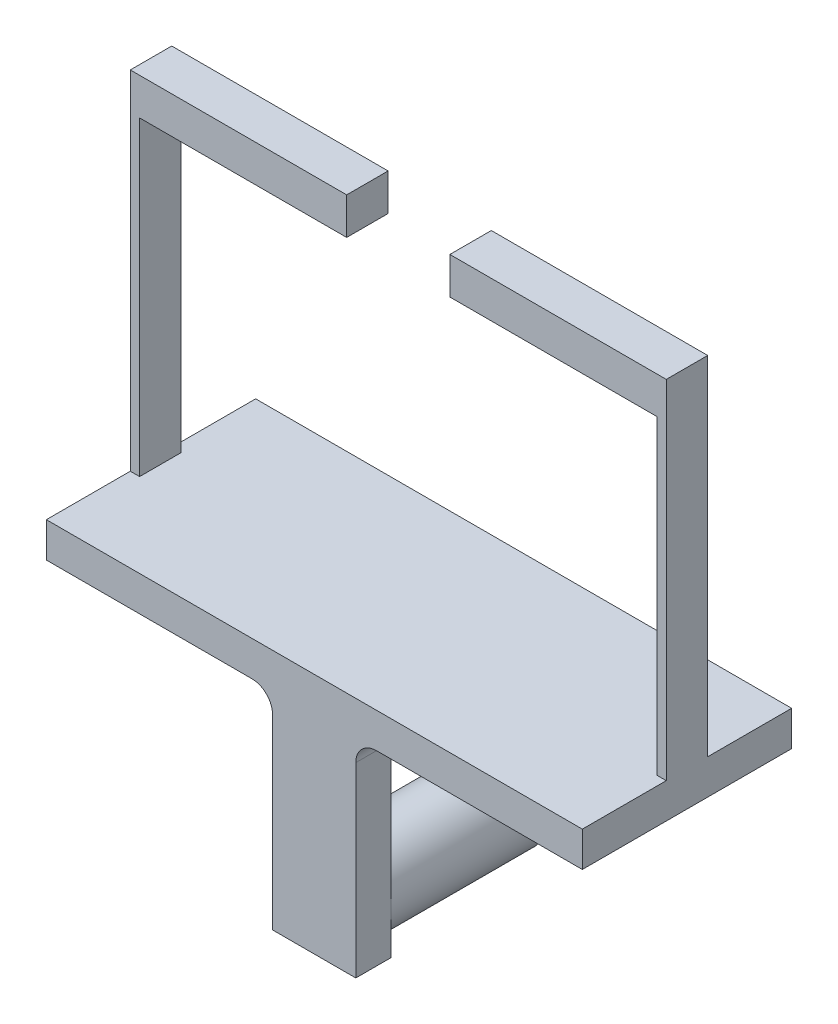
ISO-10303-21;
HEADER;
FILE_DESCRIPTION(('STEP AP214'),'2;1');
FILE_NAME('part.step','',(''),(''),'','','');
FILE_SCHEMA(('AUTOMOTIVE_DESIGN { 1 0 10303 214 1 1 1 1 }'));
ENDSEC;
DATA;
#1=APPLICATION_CONTEXT('core data for automotive mechanical design processes');
#2=APPLICATION_PROTOCOL_DEFINITION('international standard','automotive_design',2000,#1);
#3=PRODUCT_CONTEXT('',#1,'mechanical');
#4=PRODUCT('Part','Part','',(#3));
#5=PRODUCT_RELATED_PRODUCT_CATEGORY('part','',(#4));
#6=PRODUCT_DEFINITION_FORMATION('','',#4);
#7=PRODUCT_DEFINITION_CONTEXT('part definition',#1,'design');
#8=PRODUCT_DEFINITION('design','',#6,#7);
#9=PRODUCT_DEFINITION_SHAPE('','',#8);
#10=(LENGTH_UNIT() NAMED_UNIT(*) SI_UNIT(.MILLI.,.METRE.));
#11=(NAMED_UNIT(*) PLANE_ANGLE_UNIT() SI_UNIT($,.RADIAN.));
#12=(NAMED_UNIT(*) SI_UNIT($,.STERADIAN.) SOLID_ANGLE_UNIT());
#13=UNCERTAINTY_MEASURE_WITH_UNIT(LENGTH_MEASURE(1.E-05),#10,'distance_accuracy_value','');
#14=(GEOMETRIC_REPRESENTATION_CONTEXT(3) GLOBAL_UNCERTAINTY_ASSIGNED_CONTEXT((#13)) GLOBAL_UNIT_ASSIGNED_CONTEXT((#10,
#11,#12)) REPRESENTATION_CONTEXT('',''));
#15=CARTESIAN_POINT('',(0.,0.,0.));
#16=DIRECTION('',(0.,0.,1.));
#17=DIRECTION('',(1.,0.,0.));
#18=AXIS2_PLACEMENT_3D('',#15,#16,#17);
#19=CARTESIAN_POINT('',(0.,29.68752,0.));
#20=DIRECTION('',(0.,-1.,0.));
#21=DIRECTION('',(0.,0.,-1.));
#22=AXIS2_PLACEMENT_3D('',#19,#20,#21);
#23=PLANE('',#22);
#24=DIRECTION('',(1.,0.,0.));
#25=VECTOR('',#24,1.);
#26=CARTESIAN_POINT('',(-44.9980277605177,29.68752,-17.9190480402712));
#27=LINE('',#26,#25);
#28=CARTESIAN_POINT('',(-44.9980277605177,29.68752,-17.9190480402712));
#29=VERTEX_POINT('',#28);
#30=CARTESIAN_POINT('',(-43.8550277605177,29.68752,-17.9190480402712));
#31=VERTEX_POINT('',#30);
#32=EDGE_CURVE('E281',#29,#31,#27,.T.);
#33=ORIENTED_EDGE('',*,*,#32,.F.);
#34=DIRECTION('',(0.,0.,1.));
#35=VECTOR('',#34,1.);
#36=CARTESIAN_POINT('',(-44.9980277605177,29.68752,-7.63204804027117));
#37=LINE('',#36,#35);
#38=CARTESIAN_POINT('',(-44.9980277605177,29.68752,-7.63204804027117));
#39=VERTEX_POINT('',#38);
#40=EDGE_CURVE('E221',#29,#39,#37,.T.);
#41=ORIENTED_EDGE('',*,*,#40,.T.);
#42=DIRECTION('',(1.,0.,0.));
#43=VECTOR('',#42,1.);
#44=CARTESIAN_POINT('',(-44.9980277605177,29.68752,-7.63204804027117));
#45=LINE('',#44,#43);
#46=CARTESIAN_POINT('',(20.6965322394823,29.68752,-7.63204804027119));
#47=VERTEX_POINT('',#46);
#48=EDGE_CURVE('E326',#39,#47,#45,.T.);
#49=ORIENTED_EDGE('',*,*,#48,.T.);
#50=DIRECTION('',(0.,0.,-1.));
#51=VECTOR('',#50,1.);
#52=CARTESIAN_POINT('',(20.6965322394823,29.68752,-7.63204804027119));
#53=LINE('',#52,#51);
#54=CARTESIAN_POINT('',(20.6965322394823,29.68752,-17.9190480402712));
#55=VERTEX_POINT('',#54);
#56=EDGE_CURVE('E321',#47,#55,#53,.T.);
#57=ORIENTED_EDGE('',*,*,#56,.T.);
#58=DIRECTION('',(1.,0.,0.));
#59=VECTOR('',#58,1.);
#60=CARTESIAN_POINT('',(20.6965322394823,29.68752,-17.9190480402712));
#61=LINE('',#60,#59);
#62=CARTESIAN_POINT('',(19.5414560760783,29.68752,-17.9190480402712));
#63=VERTEX_POINT('',#62);
#64=EDGE_CURVE('E312',#63,#55,#61,.T.);
#65=ORIENTED_EDGE('',*,*,#64,.F.);
#66=DIRECTION('',(0.,0.,1.));
#67=VECTOR('',#66,1.);
#68=CARTESIAN_POINT('',(19.5414560760783,29.68752,-22.9990480402712));
#69=LINE('',#68,#67);
#70=CARTESIAN_POINT('',(19.5414560760783,29.68752,-22.9990480402712));
#71=VERTEX_POINT('',#70);
#72=EDGE_CURVE('E317',#71,#63,#69,.T.);
#73=ORIENTED_EDGE('',*,*,#72,.F.);
#74=DIRECTION('',(-1.,0.,0.));
#75=VECTOR('',#74,1.);
#76=CARTESIAN_POINT('',(20.6965322394823,29.68752,-22.9990480402712));
#77=LINE('',#76,#75);
#78=CARTESIAN_POINT('',(20.6965322394823,29.68752,-22.9990480402712));
#79=VERTEX_POINT('',#78);
#80=EDGE_CURVE('E288',#79,#71,#77,.T.);
#81=ORIENTED_EDGE('',*,*,#80,.F.);
#82=CARTESIAN_POINT('',(20.6965322394823,29.68752,-33.2860480402712));
#83=VERTEX_POINT('',#82);
#84=EDGE_CURVE('E327',#79,#83,#53,.T.);
#85=ORIENTED_EDGE('',*,*,#84,.T.);
#86=DIRECTION('',(-1.,0.,0.));
#87=VECTOR('',#86,1.);
#88=CARTESIAN_POINT('',(-44.9980277605177,29.68752,-33.2860480402712));
#89=LINE('',#88,#87);
#90=CARTESIAN_POINT('',(-44.9980277605177,29.68752,-33.2860480402712));
#91=VERTEX_POINT('',#90);
#92=EDGE_CURVE('E322',#83,#91,#89,.T.);
#93=ORIENTED_EDGE('',*,*,#92,.T.);
#94=CARTESIAN_POINT('',(-44.9980277605177,29.68752,-22.9990480402712));
#95=VERTEX_POINT('',#94);
#96=EDGE_CURVE('E328',#91,#95,#37,.T.);
#97=ORIENTED_EDGE('',*,*,#96,.T.);
#98=DIRECTION('',(-1.,0.,0.));
#99=VECTOR('',#98,1.);
#100=CARTESIAN_POINT('',(-44.9980277605177,29.68752,-22.9990480402712));
#101=LINE('',#100,#99);
#102=CARTESIAN_POINT('',(-43.8550277605177,29.68752,-22.9990480402712));
#103=VERTEX_POINT('',#102);
#104=EDGE_CURVE('E286',#103,#95,#101,.T.);
#105=ORIENTED_EDGE('',*,*,#104,.F.);
#106=DIRECTION('',(0.,0.,-1.));
#107=VECTOR('',#106,1.);
#108=CARTESIAN_POINT('',(-43.8550277605177,29.68752,-17.9190480402712));
#109=LINE('',#108,#107);
#110=EDGE_CURVE('E287',#31,#103,#109,.T.);
#111=ORIENTED_EDGE('',*,*,#110,.F.);
#112=EDGE_LOOP('',(#33,#41,#49,#57,#65,#73,#81,#85,#93,#97,#105,#111));
#113=FACE_BOUND('',#112,.T.);
#114=ADVANCED_FACE('F54',(#113),#23,.F.);
#115=CARTESIAN_POINT('',(-17.2688477605177,25.4,-11.9195680402712));
#116=DIRECTION('',(0.,0.,1.));
#117=DIRECTION('',(1.,0.,0.));
#118=AXIS2_PLACEMENT_3D('',#115,#116,#117);
#119=PLANE('',#118);
#120=DIRECTION('',(0.,-1.,0.));
#121=VECTOR('',#120,1.);
#122=CARTESIAN_POINT('',(-17.2688477605177,25.4,-11.9195680402712));
#123=LINE('',#122,#121);
#124=CARTESIAN_POINT('',(-17.2688477605177,5.098542,-11.9195680402712));
#125=VERTEX_POINT('',#124);
#126=CARTESIAN_POINT('',(-17.2688477605177,0.,-11.9195680402712));
#127=VERTEX_POINT('',#126);
#128=EDGE_CURVE('E379',#125,#127,#123,.T.);
#129=ORIENTED_EDGE('',*,*,#128,.F.);
#130=CARTESIAN_POINT('',(-12.1697977605177,5.098542,-11.9195680402712));
#131=DIRECTION('',(0.,0.,1.));
#132=DIRECTION('',(1.,0.,0.));
#133=AXIS2_PLACEMENT_3D('',#130,#131,#132);
#134=CIRCLE('',#133,5.09905);
#135=CARTESIAN_POINT('',(-12.241772594564,0.,-11.9195680402712));
#136=VERTEX_POINT('',#135);
#137=EDGE_CURVE('E362',#125,#136,#134,.T.);
#138=ORIENTED_EDGE('',*,*,#137,.T.);
#139=DIRECTION('',(-1.,0.,0.));
#140=VECTOR('',#139,1.);
#141=CARTESIAN_POINT('',(-17.2688477605177,0.,-11.9195680402712));
#142=LINE('',#141,#140);
#143=EDGE_CURVE('E387',#136,#127,#142,.T.);
#144=ORIENTED_EDGE('',*,*,#143,.T.);
#145=EDGE_LOOP('',(#129,#138,#144));
#146=FACE_BOUND('',#145,.T.);
#147=ADVANCED_FACE('F463',(#146),#119,.F.);
#148=CARTESIAN_POINT('',(-17.2688477605177,22.86,-11.9195680402712));
#149=VERTEX_POINT('',#148);
#150=EDGE_CURVE('E390',#149,#125,#123,.T.);
#151=ORIENTED_EDGE('',*,*,#150,.F.);
#152=DIRECTION('',(-1.,0.,0.));
#153=VECTOR('',#152,1.);
#154=CARTESIAN_POINT('',(-17.2688477605177,22.86,-11.9195680402712));
#155=LINE('',#154,#153);
#156=CARTESIAN_POINT('',(-7.0707477605177,22.86,-11.9195680402712));
#157=VERTEX_POINT('',#156);
#158=EDGE_CURVE('E394',#149,#157,#155,.F.);
#159=ORIENTED_EDGE('',*,*,#158,.T.);
#160=DIRECTION('',(0.,-1.,0.));
#161=VECTOR('',#160,1.);
#162=CARTESIAN_POINT('',(-7.0707477605177,25.4,-11.9195680402712));
#163=LINE('',#162,#161);
#164=CARTESIAN_POINT('',(-7.0707477605177,5.098542,-11.9195680402712));
#165=VERTEX_POINT('',#164);
#166=EDGE_CURVE('E419',#157,#165,#163,.T.);
#167=ORIENTED_EDGE('',*,*,#166,.T.);
#168=EDGE_CURVE('E351',#165,#125,#134,.T.);
#169=ORIENTED_EDGE('',*,*,#168,.T.);
#170=EDGE_LOOP('',(#151,#159,#167,#169));
#171=FACE_BOUND('',#170,.T.);
#172=ADVANCED_FACE('F417',(#171),#119,.F.);
#173=CARTESIAN_POINT('',(-17.2688477605177,25.4,-11.9195680402712));
#174=DIRECTION('',(1.,0.,0.));
#175=DIRECTION('',(0.,0.,-1.));
#176=AXIS2_PLACEMENT_3D('',#173,#174,#175);
#177=PLANE('',#176);
#178=DIRECTION('',(0.,-1.,0.));
#179=VECTOR('',#178,1.);
#180=CARTESIAN_POINT('',(-17.2688477605177,25.4,-7.63204804027118));
#181=LINE('',#180,#179);
#182=CARTESIAN_POINT('',(-17.2688477605177,22.86,-7.63204804027118));
#183=VERTEX_POINT('',#182);
#184=CARTESIAN_POINT('',(-17.2688477605177,0.,-7.63204804027118));
#185=VERTEX_POINT('',#184);
#186=EDGE_CURVE('E375',#183,#185,#181,.T.);
#187=ORIENTED_EDGE('',*,*,#186,.F.);
#188=DIRECTION('',(0.,0.,1.));
#189=VECTOR('',#188,1.);
#190=CARTESIAN_POINT('',(-17.2688477605177,22.86,-11.9195680402712));
#191=LINE('',#190,#189);
#192=EDGE_CURVE('E398',#183,#149,#191,.F.);
#193=ORIENTED_EDGE('',*,*,#192,.T.);
#194=ORIENTED_EDGE('',*,*,#150,.T.);
#195=ORIENTED_EDGE('',*,*,#128,.T.);
#196=DIRECTION('',(0.,0.,1.));
#197=VECTOR('',#196,1.);
#198=CARTESIAN_POINT('',(-17.2688477605177,0.,-11.9195680402712));
#199=LINE('',#198,#197);
#200=EDGE_CURVE('E356',#127,#185,#199,.T.);
#201=ORIENTED_EDGE('',*,*,#200,.T.);
#202=EDGE_LOOP('',(#187,#193,#194,#195,#201));
#203=FACE_BOUND('',#202,.T.);
#204=ADVANCED_FACE('F453',(#203),#177,.F.);
#205=CARTESIAN_POINT('',(-17.2688477605177,25.4,-7.63204804027118));
#206=DIRECTION('',(0.,0.,-1.));
#207=DIRECTION('',(-1.,0.,0.));
#208=AXIS2_PLACEMENT_3D('',#205,#206,#207);
#209=PLANE('',#208);
#210=DIRECTION('',(1.,0.,0.));
#211=VECTOR('',#210,1.);
#212=CARTESIAN_POINT('',(-17.2688477605177,0.,-7.63204804027118));
#213=LINE('',#212,#211);
#214=CARTESIAN_POINT('',(-7.0707477605177,0.,-7.63204804027118));
#215=VERTEX_POINT('',#214);
#216=EDGE_CURVE('E506',#185,#215,#213,.T.);
#217=ORIENTED_EDGE('',*,*,#216,.T.);
#218=DIRECTION('',(0.,-1.,0.));
#219=VECTOR('',#218,1.);
#220=CARTESIAN_POINT('',(-7.0707477605177,25.4,-7.63204804027118));
#221=LINE('',#220,#219);
#222=CARTESIAN_POINT('',(-7.0707477605177,22.86,-7.63204804027118));
#223=VERTEX_POINT('',#222);
#224=EDGE_CURVE('E421',#223,#215,#221,.T.);
#225=ORIENTED_EDGE('',*,*,#224,.F.);
#226=CARTESIAN_POINT('',(-4.5307477605177,22.86,-7.63204804027118));
#227=DIRECTION('',(0.,0.,-1.));
#228=DIRECTION('',(-1.,0.,0.));
#229=AXIS2_PLACEMENT_3D('',#226,#227,#228);
#230=CIRCLE('',#229,2.54);
#231=CARTESIAN_POINT('',(-4.5307477605177,25.4,-7.63204804027119));
#232=VERTEX_POINT('',#231);
#233=EDGE_CURVE('E12',#223,#232,#230,.T.);
#234=ORIENTED_EDGE('',*,*,#233,.T.);
#235=DIRECTION('',(1.,0.,0.));
#236=VECTOR('',#235,1.);
#237=CARTESIAN_POINT('',(-44.9980277605177,25.4,-7.63204804027117));
#238=LINE('',#237,#236);
#239=CARTESIAN_POINT('',(20.6965322394823,25.4,-7.63204804027119));
#240=VERTEX_POINT('',#239);
#241=EDGE_CURVE('E339',#232,#240,#238,.T.);
#242=ORIENTED_EDGE('',*,*,#241,.T.);
#243=DIRECTION('',(0.,-1.,0.));
#244=VECTOR('',#243,1.);
#245=CARTESIAN_POINT('',(20.6965322394823,29.68752,-7.63204804027119));
#246=LINE('',#245,#244);
#247=EDGE_CURVE('E334',#47,#240,#246,.T.);
#248=ORIENTED_EDGE('',*,*,#247,.F.);
#249=ORIENTED_EDGE('',*,*,#48,.F.);
#250=DIRECTION('',(0.,-1.,0.));
#251=VECTOR('',#250,1.);
#252=CARTESIAN_POINT('',(-44.9980277605177,29.68752,-7.63204804027117));
#253=LINE('',#252,#251);
#254=CARTESIAN_POINT('',(-44.9980277605177,25.4,-7.63204804027117));
#255=VERTEX_POINT('',#254);
#256=EDGE_CURVE('E342',#39,#255,#253,.T.);
#257=ORIENTED_EDGE('',*,*,#256,.T.);
#258=CARTESIAN_POINT('',(-19.8088477605177,25.4,-7.63204804027118));
#259=VERTEX_POINT('',#258);
#260=EDGE_CURVE('E338',#255,#259,#238,.T.);
#261=ORIENTED_EDGE('',*,*,#260,.T.);
#262=CARTESIAN_POINT('',(-19.8088477605177,22.86,-7.63204804027118));
#263=DIRECTION('',(0.,0.,-1.));
#264=DIRECTION('',(-1.,0.,0.));
#265=AXIS2_PLACEMENT_3D('',#262,#263,#264);
#266=CIRCLE('',#265,2.54);
#267=EDGE_CURVE('E405',#259,#183,#266,.T.);
#268=ORIENTED_EDGE('',*,*,#267,.T.);
#269=ORIENTED_EDGE('',*,*,#186,.T.);
#270=EDGE_LOOP('',(#217,#225,#234,#242,#248,#249,#257,#261,#268,#269));
#271=FACE_BOUND('',#270,.T.);
#272=ADVANCED_FACE('F426',(#271),#209,.F.);
#273=CARTESIAN_POINT('',(-7.0707477605177,25.4,-11.9195680402712));
#274=DIRECTION('',(-1.,0.,0.));
#275=DIRECTION('',(0.,0.,1.));
#276=AXIS2_PLACEMENT_3D('',#273,#274,#275);
#277=PLANE('',#276);
#278=ORIENTED_EDGE('',*,*,#166,.F.);
#279=DIRECTION('',(0.,0.,-1.));
#280=VECTOR('',#279,1.);
#281=CARTESIAN_POINT('',(-7.0707477605177,22.86,-11.9195680402712));
#282=LINE('',#281,#280);
#283=EDGE_CURVE('E66',#157,#223,#282,.F.);
#284=ORIENTED_EDGE('',*,*,#283,.T.);
#285=ORIENTED_EDGE('',*,*,#224,.T.);
#286=DIRECTION('',(0.,0.,-1.));
#287=VECTOR('',#286,1.);
#288=CARTESIAN_POINT('',(-7.0707477605177,0.,-11.9195680402712));
#289=LINE('',#288,#287);
#290=CARTESIAN_POINT('',(-7.0707477605177,0.,-11.9195680402712));
#291=VERTEX_POINT('',#290);
#292=EDGE_CURVE('E383',#215,#291,#289,.T.);
#293=ORIENTED_EDGE('',*,*,#292,.T.);
#294=EDGE_CURVE('E422',#165,#291,#163,.T.);
#295=ORIENTED_EDGE('',*,*,#294,.F.);
#296=EDGE_LOOP('',(#278,#284,#285,#293,#295));
#297=FACE_BOUND('',#296,.T.);
#298=ADVANCED_FACE('F418',(#297),#277,.F.);
#299=CARTESIAN_POINT('',(-12.0978229264714,0.,-11.9195680402712));
#300=VERTEX_POINT('',#299);
#301=EDGE_CURVE('E380',#291,#300,#142,.T.);
#302=ORIENTED_EDGE('',*,*,#301,.T.);
#303=EDGE_CURVE('E367',#300,#165,#134,.T.);
#304=ORIENTED_EDGE('',*,*,#303,.T.);
#305=ORIENTED_EDGE('',*,*,#294,.T.);
#306=EDGE_LOOP('',(#302,#304,#305));
#307=FACE_BOUND('',#306,.T.);
#308=ADVANCED_FACE('F474',(#307),#119,.F.);
#309=CARTESIAN_POINT('',(0.,0.,0.));
#310=DIRECTION('',(0.,1.,0.));
#311=DIRECTION('',(0.,0.,1.));
#312=AXIS2_PLACEMENT_3D('',#309,#310,#311);
#313=PLANE('',#312);
#314=ORIENTED_EDGE('',*,*,#200,.F.);
#315=ORIENTED_EDGE('',*,*,#143,.F.);
#316=CARTESIAN_POINT('',(-12.1697977605177,5.098542,-11.9195680402712));
#317=DIRECTION('',(0.,0.,-1.));
#318=DIRECTION('',(0.0141153418864927,-0.999900373599004,0.));
#319=AXIS2_PLACEMENT_3D('',#316,#317,#318);
#320=CIRCLE('',#319,5.09905);
#321=EDGE_CURVE('E382',#300,#136,#320,.T.);
#322=ORIENTED_EDGE('',*,*,#321,.F.);
#323=ORIENTED_EDGE('',*,*,#301,.F.);
#324=ORIENTED_EDGE('',*,*,#292,.F.);
#325=ORIENTED_EDGE('',*,*,#216,.F.);
#326=EDGE_LOOP('',(#314,#315,#322,#323,#324,#325));
#327=FACE_BOUND('',#326,.T.);
#328=ADVANCED_FACE('F492',(#327),#313,.F.);
#329=CARTESIAN_POINT('',(-12.1697977605177,5.098542,-30.9695680402712));
#330=DIRECTION('',(0.,0.,1.));
#331=DIRECTION('',(1.,0.,0.));
#332=AXIS2_PLACEMENT_3D('',#329,#330,#331);
#333=CYLINDRICAL_SURFACE('',#332,5.09905);
#334=CARTESIAN_POINT('',(-12.1697977605177,5.098542,-30.9695680402712));
#335=DIRECTION('',(0.,0.,1.));
#336=DIRECTION('',(1.,0.,0.));
#337=AXIS2_PLACEMENT_3D('',#334,#335,#336);
#338=CIRCLE('',#337,5.09905);
#339=CARTESIAN_POINT('',(-7.0707477605177,5.098542,-30.9695680402712));
#340=VERTEX_POINT('',#339);
#341=EDGE_CURVE('E353',#340,#340,#338,.T.);
#342=ORIENTED_EDGE('',*,*,#341,.T.);
#343=EDGE_LOOP('',(#342));
#344=FACE_BOUND('',#343,.T.);
#345=ORIENTED_EDGE('',*,*,#168,.F.);
#346=ORIENTED_EDGE('',*,*,#303,.F.);
#347=ORIENTED_EDGE('',*,*,#321,.T.);
#348=ORIENTED_EDGE('',*,*,#137,.F.);
#349=EDGE_LOOP('',(#345,#346,#347,#348));
#350=FACE_BOUND('',#349,.T.);
#351=ADVANCED_FACE('F493',(#344,#350),#333,.T.);
#352=CARTESIAN_POINT('',(-12.1697977605177,5.098542,-30.9695680402712));
#353=DIRECTION('',(0.,0.,1.));
#354=DIRECTION('',(1.,0.,0.));
#355=AXIS2_PLACEMENT_3D('',#352,#353,#354);
#356=PLANE('',#355);
#357=ORIENTED_EDGE('',*,*,#341,.F.);
#358=EDGE_LOOP('',(#357));
#359=FACE_BOUND('',#358,.T.);
#360=ADVANCED_FACE('F486',(#359),#356,.F.);
#361=CARTESIAN_POINT('',(20.6965322394823,29.68752,-7.63204804027119));
#362=DIRECTION('',(-1.,0.,0.));
#363=DIRECTION('',(0.,0.,1.));
#364=AXIS2_PLACEMENT_3D('',#361,#362,#363);
#365=PLANE('',#364);
#366=DIRECTION('',(0.,0.,-1.));
#367=VECTOR('',#366,1.);
#368=CARTESIAN_POINT('',(20.6965322394823,25.4,-7.63204804027119));
#369=LINE('',#368,#367);
#370=CARTESIAN_POINT('',(20.6965322394823,25.4,-33.2860480402712));
#371=VERTEX_POINT('',#370);
#372=EDGE_CURVE('E297',#240,#371,#369,.T.);
#373=ORIENTED_EDGE('',*,*,#372,.T.);
#374=DIRECTION('',(0.,-1.,0.));
#375=VECTOR('',#374,1.);
#376=CARTESIAN_POINT('',(20.6965322394823,29.68752,-33.2860480402712));
#377=LINE('',#376,#375);
#378=EDGE_CURVE('E352',#83,#371,#377,.T.);
#379=ORIENTED_EDGE('',*,*,#378,.F.);
#380=ORIENTED_EDGE('',*,*,#84,.F.);
#381=DIRECTION('',(0.,-1.,0.));
#382=VECTOR('',#381,1.);
#383=CARTESIAN_POINT('',(20.6965322394823,67.76212,-22.9990480402712));
#384=LINE('',#383,#382);
#385=CARTESIAN_POINT('',(20.6965322394823,72.28332,-22.9990480402712));
#386=VERTEX_POINT('',#385);
#387=EDGE_CURVE('E259',#386,#79,#384,.T.);
#388=ORIENTED_EDGE('',*,*,#387,.F.);
#389=DIRECTION('',(0.,0.,-1.));
#390=VECTOR('',#389,1.);
#391=CARTESIAN_POINT('',(20.6965322394823,72.28332,-17.9190480402712));
#392=LINE('',#391,#390);
#393=CARTESIAN_POINT('',(20.6965322394823,72.28332,-17.9190480402712));
#394=VERTEX_POINT('',#393);
#395=EDGE_CURVE('E272',#394,#386,#392,.T.);
#396=ORIENTED_EDGE('',*,*,#395,.F.);
#397=DIRECTION('',(0.,-1.,0.));
#398=VECTOR('',#397,1.);
#399=CARTESIAN_POINT('',(20.6965322394823,67.76212,-17.9190480402712));
#400=LINE('',#399,#398);
#401=EDGE_CURVE('E307',#394,#55,#400,.T.);
#402=ORIENTED_EDGE('',*,*,#401,.T.);
#403=ORIENTED_EDGE('',*,*,#56,.F.);
#404=ORIENTED_EDGE('',*,*,#247,.T.);
#405=EDGE_LOOP('',(#373,#379,#380,#388,#396,#402,#403,#404));
#406=FACE_BOUND('',#405,.T.);
#407=ADVANCED_FACE('F436',(#406),#365,.F.);
#408=CARTESIAN_POINT('',(-44.9980277605177,29.68752,-33.2860480402712));
#409=DIRECTION('',(0.,0.,1.));
#410=DIRECTION('',(1.,0.,0.));
#411=AXIS2_PLACEMENT_3D('',#408,#409,#410);
#412=PLANE('',#411);
#413=DIRECTION('',(-1.,0.,0.));
#414=VECTOR('',#413,1.);
#415=CARTESIAN_POINT('',(-44.9980277605177,25.4,-33.2860480402712));
#416=LINE('',#415,#414);
#417=CARTESIAN_POINT('',(-44.9980277605177,25.4,-33.2860480402712));
#418=VERTEX_POINT('',#417);
#419=EDGE_CURVE('E333',#371,#418,#416,.T.);
#420=ORIENTED_EDGE('',*,*,#419,.T.);
#421=DIRECTION('',(0.,-1.,0.));
#422=VECTOR('',#421,1.);
#423=CARTESIAN_POINT('',(-44.9980277605177,29.68752,-33.2860480402712));
#424=LINE('',#423,#422);
#425=EDGE_CURVE('E348',#91,#418,#424,.T.);
#426=ORIENTED_EDGE('',*,*,#425,.F.);
#427=ORIENTED_EDGE('',*,*,#92,.F.);
#428=ORIENTED_EDGE('',*,*,#378,.T.);
#429=EDGE_LOOP('',(#420,#426,#427,#428));
#430=FACE_BOUND('',#429,.T.);
#431=ADVANCED_FACE('F481',(#430),#412,.F.);
#432=CARTESIAN_POINT('',(-44.9980277605177,29.68752,-7.63204804027117));
#433=DIRECTION('',(1.,0.,0.));
#434=DIRECTION('',(0.,0.,-1.));
#435=AXIS2_PLACEMENT_3D('',#432,#433,#434);
#436=PLANE('',#435);
#437=DIRECTION('',(0.,0.,1.));
#438=VECTOR('',#437,1.);
#439=CARTESIAN_POINT('',(-44.9980277605177,25.4,-7.63204804027117));
#440=LINE('',#439,#438);
#441=EDGE_CURVE('E340',#418,#255,#440,.T.);
#442=ORIENTED_EDGE('',*,*,#441,.T.);
#443=ORIENTED_EDGE('',*,*,#256,.F.);
#444=ORIENTED_EDGE('',*,*,#40,.F.);
#445=DIRECTION('',(0.,-1.,0.));
#446=VECTOR('',#445,1.);
#447=CARTESIAN_POINT('',(-44.9980277605177,67.76212,-17.9190480402712));
#448=LINE('',#447,#446);
#449=CARTESIAN_POINT('',(-44.9980277605177,72.28332,-17.9190480402712));
#450=VERTEX_POINT('',#449);
#451=EDGE_CURVE('E220',#450,#29,#448,.T.);
#452=ORIENTED_EDGE('',*,*,#451,.F.);
#453=DIRECTION('',(0.,0.,1.));
#454=VECTOR('',#453,1.);
#455=CARTESIAN_POINT('',(-44.9980277605177,72.28332,-22.9990480402712));
#456=LINE('',#455,#454);
#457=CARTESIAN_POINT('',(-44.9980277605177,72.28332,-22.9990480402712));
#458=VERTEX_POINT('',#457);
#459=EDGE_CURVE('E224',#458,#450,#456,.T.);
#460=ORIENTED_EDGE('',*,*,#459,.F.);
#461=DIRECTION('',(0.,-1.,0.));
#462=VECTOR('',#461,1.);
#463=CARTESIAN_POINT('',(-44.9980277605177,67.76212,-22.9990480402712));
#464=LINE('',#463,#462);
#465=EDGE_CURVE('E227',#458,#95,#464,.T.);
#466=ORIENTED_EDGE('',*,*,#465,.T.);
#467=ORIENTED_EDGE('',*,*,#96,.F.);
#468=ORIENTED_EDGE('',*,*,#425,.T.);
#469=EDGE_LOOP('',(#442,#443,#444,#452,#460,#466,#467,#468));
#470=FACE_BOUND('',#469,.T.);
#471=ADVANCED_FACE('F219',(#470),#436,.F.);
#472=CARTESIAN_POINT('',(0.,25.4,0.));
#473=DIRECTION('',(0.,-1.,0.));
#474=DIRECTION('',(0.,0.,-1.));
#475=AXIS2_PLACEMENT_3D('',#472,#473,#474);
#476=PLANE('',#475);
#477=ORIENTED_EDGE('',*,*,#241,.F.);
#478=DIRECTION('',(0.,0.,-1.));
#479=VECTOR('',#478,1.);
#480=CARTESIAN_POINT('',(-4.5307477605177,25.4,0.));
#481=LINE('',#480,#479);
#482=CARTESIAN_POINT('',(-4.5307477605177,25.4,-14.4595680402712));
#483=VERTEX_POINT('',#482);
#484=EDGE_CURVE('E408',#232,#483,#481,.T.);
#485=ORIENTED_EDGE('',*,*,#484,.T.);
#486=DIRECTION('',(-1.,0.,0.));
#487=VECTOR('',#486,1.);
#488=CARTESIAN_POINT('',(0.,25.4,-14.4595680402712));
#489=LINE('',#488,#487);
#490=CARTESIAN_POINT('',(-19.8088477605177,25.4,-14.4595680402712));
#491=VERTEX_POINT('',#490);
#492=EDGE_CURVE('E76',#483,#491,#489,.T.);
#493=ORIENTED_EDGE('',*,*,#492,.T.);
#494=DIRECTION('',(0.,0.,1.));
#495=VECTOR('',#494,1.);
#496=CARTESIAN_POINT('',(-19.8088477605177,25.4,0.));
#497=LINE('',#496,#495);
#498=EDGE_CURVE('E399',#491,#259,#497,.T.);
#499=ORIENTED_EDGE('',*,*,#498,.T.);
#500=ORIENTED_EDGE('',*,*,#260,.F.);
#501=ORIENTED_EDGE('',*,*,#441,.F.);
#502=ORIENTED_EDGE('',*,*,#419,.F.);
#503=ORIENTED_EDGE('',*,*,#372,.F.);
#504=EDGE_LOOP('',(#477,#485,#493,#499,#500,#501,#502,#503));
#505=FACE_BOUND('',#504,.T.);
#506=ADVANCED_FACE('F435',(#505),#476,.T.);
#507=CARTESIAN_POINT('',(20.6965322394823,67.76212,-22.9990480402712));
#508=DIRECTION('',(0.,0.,1.));
#509=DIRECTION('',(1.,0.,0.));
#510=AXIS2_PLACEMENT_3D('',#507,#508,#509);
#511=PLANE('',#510);
#512=ORIENTED_EDGE('',*,*,#80,.T.);
#513=DIRECTION('',(0.,-1.,0.));
#514=VECTOR('',#513,1.);
#515=CARTESIAN_POINT('',(19.5414560760783,67.76212,-22.9990480402712));
#516=LINE('',#515,#514);
#517=CARTESIAN_POINT('',(19.5414560760783,67.76212,-22.9990480402712));
#518=VERTEX_POINT('',#517);
#519=EDGE_CURVE('E303',#518,#71,#516,.T.);
#520=ORIENTED_EDGE('',*,*,#519,.F.);
#521=DIRECTION('',(-1.,0.,0.));
#522=VECTOR('',#521,1.);
#523=CARTESIAN_POINT('',(20.6965322394823,67.76212,-22.9990480402712));
#524=LINE('',#523,#522);
#525=CARTESIAN_POINT('',(-5.8261477605177,67.76212,-22.9990480402712));
#526=VERTEX_POINT('',#525);
#527=EDGE_CURVE('E251',#518,#526,#524,.T.);
#528=ORIENTED_EDGE('',*,*,#527,.T.);
#529=DIRECTION('',(0.,-1.,0.));
#530=VECTOR('',#529,1.);
#531=CARTESIAN_POINT('',(-5.8261477605177,72.28332,-22.9990480402712));
#532=LINE('',#531,#530);
#533=CARTESIAN_POINT('',(-5.8261477605177,72.28332,-22.9990480402712));
#534=VERTEX_POINT('',#533);
#535=EDGE_CURVE('E257',#534,#526,#532,.T.);
#536=ORIENTED_EDGE('',*,*,#535,.F.);
#537=DIRECTION('',(-1.,0.,0.));
#538=VECTOR('',#537,1.);
#539=CARTESIAN_POINT('',(20.6965322394823,72.28332,-22.9990480402712));
#540=LINE('',#539,#538);
#541=EDGE_CURVE('E276',#386,#534,#540,.T.);
#542=ORIENTED_EDGE('',*,*,#541,.F.);
#543=ORIENTED_EDGE('',*,*,#387,.T.);
#544=EDGE_LOOP('',(#512,#520,#528,#536,#542,#543));
#545=FACE_BOUND('',#544,.T.);
#546=ADVANCED_FACE('F482',(#545),#511,.F.);
#547=CARTESIAN_POINT('',(19.5414560760783,67.76212,-22.9990480402712));
#548=DIRECTION('',(1.,0.,0.));
#549=DIRECTION('',(0.,0.,-1.));
#550=AXIS2_PLACEMENT_3D('',#547,#548,#549);
#551=PLANE('',#550);
#552=ORIENTED_EDGE('',*,*,#72,.T.);
#553=DIRECTION('',(0.,-1.,0.));
#554=VECTOR('',#553,1.);
#555=CARTESIAN_POINT('',(19.5414560760783,67.76212,-17.9190480402712));
#556=LINE('',#555,#554);
#557=CARTESIAN_POINT('',(19.5414560760783,67.76212,-17.9190480402712));
#558=VERTEX_POINT('',#557);
#559=EDGE_CURVE('E306',#558,#63,#556,.T.);
#560=ORIENTED_EDGE('',*,*,#559,.F.);
#561=DIRECTION('',(0.,0.,1.));
#562=VECTOR('',#561,1.);
#563=CARTESIAN_POINT('',(19.5414560760783,67.76212,-22.9990480402712));
#564=LINE('',#563,#562);
#565=EDGE_CURVE('E315',#518,#558,#564,.T.);
#566=ORIENTED_EDGE('',*,*,#565,.F.);
#567=ORIENTED_EDGE('',*,*,#519,.T.);
#568=EDGE_LOOP('',(#552,#560,#566,#567));
#569=FACE_BOUND('',#568,.T.);
#570=ADVANCED_FACE('F647',(#569),#551,.F.);
#571=CARTESIAN_POINT('',(20.6965322394823,67.76212,-17.9190480402712));
#572=DIRECTION('',(0.,0.,-1.));
#573=DIRECTION('',(-1.,0.,0.));
#574=AXIS2_PLACEMENT_3D('',#571,#572,#573);
#575=PLANE('',#574);
#576=ORIENTED_EDGE('',*,*,#64,.T.);
#577=ORIENTED_EDGE('',*,*,#401,.F.);
#578=DIRECTION('',(1.,0.,0.));
#579=VECTOR('',#578,1.);
#580=CARTESIAN_POINT('',(20.6965322394823,72.28332,-17.9190480402712));
#581=LINE('',#580,#579);
#582=CARTESIAN_POINT('',(-5.8261477605177,72.28332,-17.9190480402712));
#583=VERTEX_POINT('',#582);
#584=EDGE_CURVE('E267',#583,#394,#581,.T.);
#585=ORIENTED_EDGE('',*,*,#584,.F.);
#586=DIRECTION('',(0.,-1.,0.));
#587=VECTOR('',#586,1.);
#588=CARTESIAN_POINT('',(-5.8261477605177,72.28332,-17.9190480402712));
#589=LINE('',#588,#587);
#590=CARTESIAN_POINT('',(-5.8261477605177,67.76212,-17.9190480402712));
#591=VERTEX_POINT('',#590);
#592=EDGE_CURVE('E263',#583,#591,#589,.T.);
#593=ORIENTED_EDGE('',*,*,#592,.T.);
#594=DIRECTION('',(1.,0.,0.));
#595=VECTOR('',#594,1.);
#596=CARTESIAN_POINT('',(20.6965322394823,67.76212,-17.9190480402712));
#597=LINE('',#596,#595);
#598=EDGE_CURVE('E269',#591,#558,#597,.T.);
#599=ORIENTED_EDGE('',*,*,#598,.T.);
#600=ORIENTED_EDGE('',*,*,#559,.T.);
#601=EDGE_LOOP('',(#576,#577,#585,#593,#599,#600));
#602=FACE_BOUND('',#601,.T.);
#603=ADVANCED_FACE('F480',(#602),#575,.F.);
#604=CARTESIAN_POINT('',(-43.8550277605177,67.76212,-17.9190480402712));
#605=DIRECTION('',(-1.,0.,0.));
#606=DIRECTION('',(0.,0.,1.));
#607=AXIS2_PLACEMENT_3D('',#604,#605,#606);
#608=PLANE('',#607);
#609=ORIENTED_EDGE('',*,*,#110,.T.);
#610=DIRECTION('',(0.,-1.,0.));
#611=VECTOR('',#610,1.);
#612=CARTESIAN_POINT('',(-43.8550277605177,67.76212,-22.9990480402712));
#613=LINE('',#612,#611);
#614=CARTESIAN_POINT('',(-43.8550277605177,67.76212,-22.9990480402712));
#615=VERTEX_POINT('',#614);
#616=EDGE_CURVE('E300',#615,#103,#613,.T.);
#617=ORIENTED_EDGE('',*,*,#616,.F.);
#618=DIRECTION('',(0.,0.,-1.));
#619=VECTOR('',#618,1.);
#620=CARTESIAN_POINT('',(-43.8550277605177,67.76212,-17.9190480402712));
#621=LINE('',#620,#619);
#622=CARTESIAN_POINT('',(-43.8550277605177,67.76212,-17.9190480402712));
#623=VERTEX_POINT('',#622);
#624=EDGE_CURVE('E285',#623,#615,#621,.T.);
#625=ORIENTED_EDGE('',*,*,#624,.F.);
#626=DIRECTION('',(0.,-1.,0.));
#627=VECTOR('',#626,1.);
#628=CARTESIAN_POINT('',(-43.8550277605177,67.76212,-17.9190480402712));
#629=LINE('',#628,#627);
#630=EDGE_CURVE('E226',#623,#31,#629,.T.);
#631=ORIENTED_EDGE('',*,*,#630,.T.);
#632=EDGE_LOOP('',(#609,#617,#625,#631));
#633=FACE_BOUND('',#632,.T.);
#634=ADVANCED_FACE('F635',(#633),#608,.F.);
#635=CARTESIAN_POINT('',(-44.9980277605177,67.76212,-22.9990480402712));
#636=DIRECTION('',(0.,0.,1.));
#637=DIRECTION('',(1.,0.,0.));
#638=AXIS2_PLACEMENT_3D('',#635,#636,#637);
#639=PLANE('',#638);
#640=ORIENTED_EDGE('',*,*,#104,.T.);
#641=ORIENTED_EDGE('',*,*,#465,.F.);
#642=DIRECTION('',(-1.,0.,0.));
#643=VECTOR('',#642,1.);
#644=CARTESIAN_POINT('',(-44.9980277605177,72.28332,-22.9990480402712));
#645=LINE('',#644,#643);
#646=CARTESIAN_POINT('',(-18.4753477605177,72.28332,-22.9990480402712));
#647=VERTEX_POINT('',#646);
#648=EDGE_CURVE('E245',#647,#458,#645,.T.);
#649=ORIENTED_EDGE('',*,*,#648,.F.);
#650=DIRECTION('',(0.,-1.,0.));
#651=VECTOR('',#650,1.);
#652=CARTESIAN_POINT('',(-18.4753477605177,72.28332,-22.9990480402712));
#653=LINE('',#652,#651);
#654=CARTESIAN_POINT('',(-18.4753477605177,67.76212,-22.9990480402712));
#655=VERTEX_POINT('',#654);
#656=EDGE_CURVE('E252',#647,#655,#653,.T.);
#657=ORIENTED_EDGE('',*,*,#656,.T.);
#658=DIRECTION('',(-1.,0.,0.));
#659=VECTOR('',#658,1.);
#660=CARTESIAN_POINT('',(-44.9980277605177,67.76212,-22.9990480402712));
#661=LINE('',#660,#659);
#662=EDGE_CURVE('E243',#655,#615,#661,.T.);
#663=ORIENTED_EDGE('',*,*,#662,.T.);
#664=ORIENTED_EDGE('',*,*,#616,.T.);
#665=EDGE_LOOP('',(#640,#641,#649,#657,#663,#664));
#666=FACE_BOUND('',#665,.T.);
#667=ADVANCED_FACE('F621',(#666),#639,.F.);
#668=CARTESIAN_POINT('',(-44.9980277605177,67.76212,-17.9190480402712));
#669=DIRECTION('',(0.,0.,-1.));
#670=DIRECTION('',(-1.,0.,0.));
#671=AXIS2_PLACEMENT_3D('',#668,#669,#670);
#672=PLANE('',#671);
#673=ORIENTED_EDGE('',*,*,#32,.T.);
#674=ORIENTED_EDGE('',*,*,#630,.F.);
#675=DIRECTION('',(1.,0.,0.));
#676=VECTOR('',#675,1.);
#677=CARTESIAN_POINT('',(-44.9980277605177,67.76212,-17.9190480402712));
#678=LINE('',#677,#676);
#679=CARTESIAN_POINT('',(-18.4753477605177,67.76212,-17.9190480402712));
#680=VERTEX_POINT('',#679);
#681=EDGE_CURVE('E255',#623,#680,#678,.T.);
#682=ORIENTED_EDGE('',*,*,#681,.T.);
#683=DIRECTION('',(0.,-1.,0.));
#684=VECTOR('',#683,1.);
#685=CARTESIAN_POINT('',(-18.4753477605177,72.28332,-17.9190480402712));
#686=LINE('',#685,#684);
#687=CARTESIAN_POINT('',(-18.4753477605177,72.28332,-17.9190480402712));
#688=VERTEX_POINT('',#687);
#689=EDGE_CURVE('E234',#688,#680,#686,.T.);
#690=ORIENTED_EDGE('',*,*,#689,.F.);
#691=DIRECTION('',(1.,0.,0.));
#692=VECTOR('',#691,1.);
#693=CARTESIAN_POINT('',(-44.9980277605177,72.28332,-17.9190480402712));
#694=LINE('',#693,#692);
#695=EDGE_CURVE('E233',#450,#688,#694,.T.);
#696=ORIENTED_EDGE('',*,*,#695,.F.);
#697=ORIENTED_EDGE('',*,*,#451,.T.);
#698=EDGE_LOOP('',(#673,#674,#682,#690,#696,#697));
#699=FACE_BOUND('',#698,.T.);
#700=ADVANCED_FACE('F235',(#699),#672,.F.);
#701=CARTESIAN_POINT('',(0.,67.76212,0.));
#702=DIRECTION('',(0.,1.,0.));
#703=DIRECTION('',(0.,0.,1.));
#704=AXIS2_PLACEMENT_3D('',#701,#702,#703);
#705=PLANE('',#704);
#706=ORIENTED_EDGE('',*,*,#681,.F.);
#707=ORIENTED_EDGE('',*,*,#624,.T.);
#708=ORIENTED_EDGE('',*,*,#662,.F.);
#709=DIRECTION('',(0.,0.,-1.));
#710=VECTOR('',#709,1.);
#711=CARTESIAN_POINT('',(-18.4753477605177,67.76212,-22.9990480402712));
#712=LINE('',#711,#710);
#713=EDGE_CURVE('E246',#680,#655,#712,.T.);
#714=ORIENTED_EDGE('',*,*,#713,.F.);
#715=EDGE_LOOP('',(#706,#707,#708,#714));
#716=FACE_BOUND('',#715,.T.);
#717=ADVANCED_FACE('F602',(#716),#705,.F.);
#718=CARTESIAN_POINT('',(-18.4753477605177,72.28332,-22.9990480402712));
#719=DIRECTION('',(-1.,0.,0.));
#720=DIRECTION('',(0.,0.,1.));
#721=AXIS2_PLACEMENT_3D('',#718,#719,#720);
#722=PLANE('',#721);
#723=ORIENTED_EDGE('',*,*,#713,.T.);
#724=ORIENTED_EDGE('',*,*,#656,.F.);
#725=DIRECTION('',(0.,0.,-1.));
#726=VECTOR('',#725,1.);
#727=CARTESIAN_POINT('',(-18.4753477605177,72.28332,-22.9990480402712));
#728=LINE('',#727,#726);
#729=EDGE_CURVE('E240',#688,#647,#728,.T.);
#730=ORIENTED_EDGE('',*,*,#729,.F.);
#731=ORIENTED_EDGE('',*,*,#689,.T.);
#732=EDGE_LOOP('',(#723,#724,#730,#731));
#733=FACE_BOUND('',#732,.T.);
#734=ADVANCED_FACE('F600',(#733),#722,.F.);
#735=CARTESIAN_POINT('',(0.,72.28332,0.));
#736=DIRECTION('',(0.,1.,0.));
#737=DIRECTION('',(0.,0.,1.));
#738=AXIS2_PLACEMENT_3D('',#735,#736,#737);
#739=PLANE('',#738);
#740=ORIENTED_EDGE('',*,*,#459,.T.);
#741=ORIENTED_EDGE('',*,*,#695,.T.);
#742=ORIENTED_EDGE('',*,*,#729,.T.);
#743=ORIENTED_EDGE('',*,*,#648,.T.);
#744=EDGE_LOOP('',(#740,#741,#742,#743));
#745=FACE_BOUND('',#744,.T.);
#746=ADVANCED_FACE('F239',(#745),#739,.T.);
#747=CARTESIAN_POINT('',(0.,67.76212,0.));
#748=DIRECTION('',(0.,1.,0.));
#749=DIRECTION('',(0.,0.,1.));
#750=AXIS2_PLACEMENT_3D('',#747,#748,#749);
#751=PLANE('',#750);
#752=ORIENTED_EDGE('',*,*,#527,.F.);
#753=ORIENTED_EDGE('',*,*,#565,.T.);
#754=ORIENTED_EDGE('',*,*,#598,.F.);
#755=DIRECTION('',(0.,0.,1.));
#756=VECTOR('',#755,1.);
#757=CARTESIAN_POINT('',(-5.8261477605177,67.76212,-17.9190480402712));
#758=LINE('',#757,#756);
#759=EDGE_CURVE('E268',#526,#591,#758,.T.);
#760=ORIENTED_EDGE('',*,*,#759,.F.);
#761=EDGE_LOOP('',(#752,#753,#754,#760));
#762=FACE_BOUND('',#761,.T.);
#763=ADVANCED_FACE('F578',(#762),#751,.F.);
#764=CARTESIAN_POINT('',(-5.8261477605177,72.28332,-17.9190480402712));
#765=DIRECTION('',(1.,0.,0.));
#766=DIRECTION('',(0.,0.,-1.));
#767=AXIS2_PLACEMENT_3D('',#764,#765,#766);
#768=PLANE('',#767);
#769=ORIENTED_EDGE('',*,*,#759,.T.);
#770=ORIENTED_EDGE('',*,*,#592,.F.);
#771=DIRECTION('',(0.,0.,1.));
#772=VECTOR('',#771,1.);
#773=CARTESIAN_POINT('',(-5.8261477605177,72.28332,-17.9190480402712));
#774=LINE('',#773,#772);
#775=EDGE_CURVE('E278',#534,#583,#774,.T.);
#776=ORIENTED_EDGE('',*,*,#775,.F.);
#777=ORIENTED_EDGE('',*,*,#535,.T.);
#778=EDGE_LOOP('',(#769,#770,#776,#777));
#779=FACE_BOUND('',#778,.T.);
#780=ADVANCED_FACE('F571',(#779),#768,.F.);
#781=CARTESIAN_POINT('',(0.,72.28332,0.));
#782=DIRECTION('',(0.,1.,0.));
#783=DIRECTION('',(0.,0.,1.));
#784=AXIS2_PLACEMENT_3D('',#781,#782,#783);
#785=PLANE('',#784);
#786=ORIENTED_EDGE('',*,*,#395,.T.);
#787=ORIENTED_EDGE('',*,*,#541,.T.);
#788=ORIENTED_EDGE('',*,*,#775,.T.);
#789=ORIENTED_EDGE('',*,*,#584,.T.);
#790=EDGE_LOOP('',(#786,#787,#788,#789));
#791=FACE_BOUND('',#790,.T.);
#792=ADVANCED_FACE('F464',(#791),#785,.T.);
#793=CARTESIAN_POINT('',(0.,22.86,-14.4595680402712));
#794=DIRECTION('',(-1.,0.,0.));
#795=DIRECTION('',(0.,0.,1.));
#796=AXIS2_PLACEMENT_3D('',#793,#794,#795);
#797=CYLINDRICAL_SURFACE('',#796,2.54);
#798=ORIENTED_EDGE('',*,*,#492,.F.);
#799=CARTESIAN_POINT('',(-4.5307477605177,22.86,-14.4595680402712));
#800=DIRECTION('',(-0.707106781186548,0.,-0.707106781186547));
#801=DIRECTION('',(-0.707106781186547,0.,0.707106781186548));
#802=AXIS2_PLACEMENT_3D('',#799,#800,#801);
#803=ELLIPSE('',#802,3.59210244842766,2.54);
#804=EDGE_CURVE('E61',#483,#157,#803,.F.);
#805=ORIENTED_EDGE('',*,*,#804,.T.);
#806=ORIENTED_EDGE('',*,*,#158,.F.);
#807=CARTESIAN_POINT('',(-19.8088477605177,22.86,-14.4595680402712));
#808=DIRECTION('',(-0.707106781186547,0.,0.707106781186547));
#809=DIRECTION('',(-0.707106781186547,0.,-0.707106781186547));
#810=AXIS2_PLACEMENT_3D('',#807,#808,#809);
#811=ELLIPSE('',#810,3.59210244842766,2.54);
#812=EDGE_CURVE('E404',#149,#491,#811,.T.);
#813=ORIENTED_EDGE('',*,*,#812,.T.);
#814=EDGE_LOOP('',(#798,#805,#806,#813));
#815=FACE_BOUND('',#814,.T.);
#816=ADVANCED_FACE('F407',(#815),#797,.F.);
#817=CARTESIAN_POINT('',(-19.8088477605177,22.86,0.));
#818=DIRECTION('',(0.,0.,1.));
#819=DIRECTION('',(1.,0.,0.));
#820=AXIS2_PLACEMENT_3D('',#817,#818,#819);
#821=CYLINDRICAL_SURFACE('',#820,2.54);
#822=ORIENTED_EDGE('',*,*,#812,.F.);
#823=ORIENTED_EDGE('',*,*,#192,.F.);
#824=ORIENTED_EDGE('',*,*,#267,.F.);
#825=ORIENTED_EDGE('',*,*,#498,.F.);
#826=EDGE_LOOP('',(#822,#823,#824,#825));
#827=FACE_BOUND('',#826,.T.);
#828=ADVANCED_FACE('F454',(#827),#821,.F.);
#829=CARTESIAN_POINT('',(-4.5307477605177,22.86,0.));
#830=DIRECTION('',(0.,0.,-1.));
#831=DIRECTION('',(-1.,0.,0.));
#832=AXIS2_PLACEMENT_3D('',#829,#830,#831);
#833=CYLINDRICAL_SURFACE('',#832,2.54);
#834=ORIENTED_EDGE('',*,*,#233,.F.);
#835=ORIENTED_EDGE('',*,*,#283,.F.);
#836=ORIENTED_EDGE('',*,*,#804,.F.);
#837=ORIENTED_EDGE('',*,*,#484,.F.);
#838=EDGE_LOOP('',(#834,#835,#836,#837));
#839=FACE_BOUND('',#838,.T.);
#840=ADVANCED_FACE('F60',(#839),#833,.F.);
#841=CLOSED_SHELL('',(#114,#147,#172,#204,#272,#298,#308,#328,#351,#360,#407,#431,#471,#506,
#546,#570,#603,#634,#667,#700,#717,#734,#746,#763,#780,#792,#816,#828,#840));
#842=MANIFOLD_SOLID_BREP('B2',#841);
#843=ADVANCED_BREP_SHAPE_REPRESENTATION('',(#18,#842),#14);
#844=SHAPE_DEFINITION_REPRESENTATION(#9,#843);
ENDSEC;
END-ISO-10303-21;
